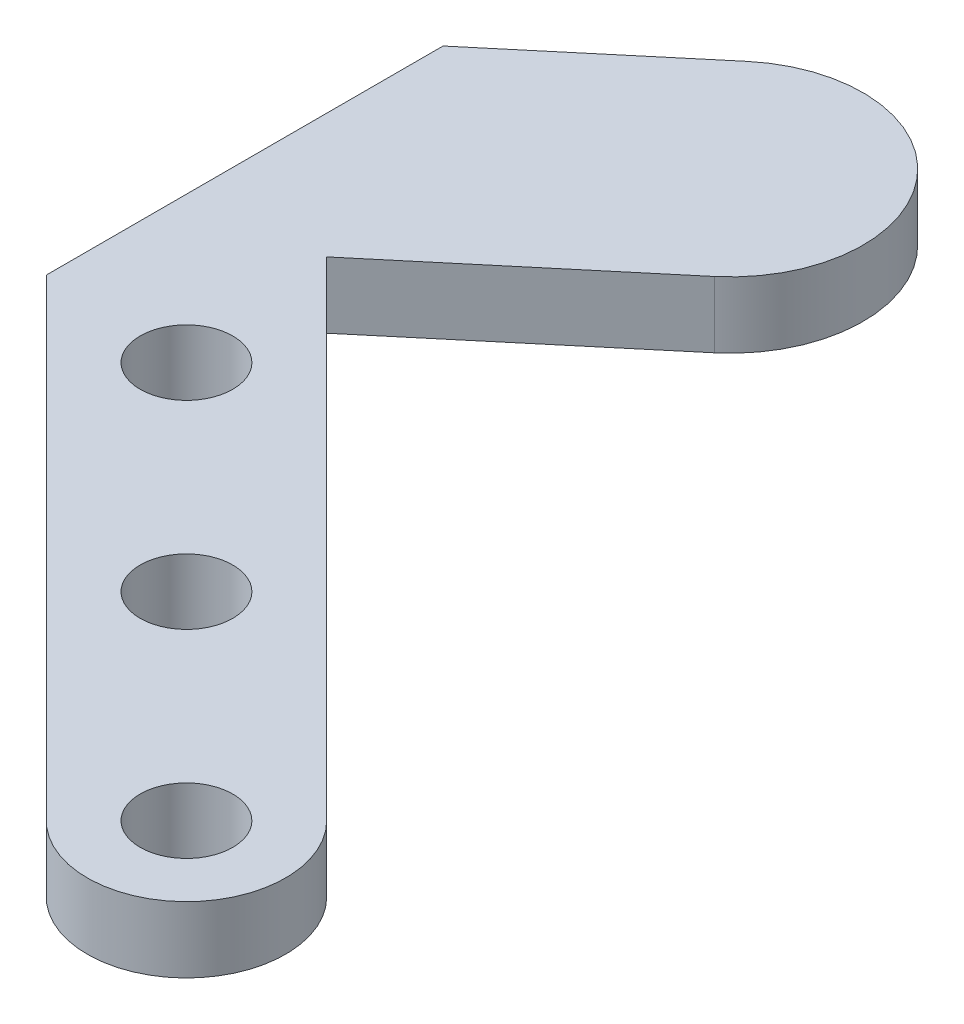
ISO-10303-21;
HEADER;
FILE_DESCRIPTION(('STEP AP214'),'2;1');
FILE_NAME('part.step','',(''),(''),'','','');
FILE_SCHEMA(('AUTOMOTIVE_DESIGN { 1 0 10303 214 1 1 1 1 }'));
ENDSEC;
DATA;
#1=APPLICATION_CONTEXT('core data for automotive mechanical design processes');
#2=APPLICATION_PROTOCOL_DEFINITION('international standard','automotive_design',2000,#1);
#3=PRODUCT_CONTEXT('',#1,'mechanical');
#4=PRODUCT('Part','Part','',(#3));
#5=PRODUCT_RELATED_PRODUCT_CATEGORY('part','',(#4));
#6=PRODUCT_DEFINITION_FORMATION('','',#4);
#7=PRODUCT_DEFINITION_CONTEXT('part definition',#1,'design');
#8=PRODUCT_DEFINITION('design','',#6,#7);
#9=PRODUCT_DEFINITION_SHAPE('','',#8);
#10=(LENGTH_UNIT() NAMED_UNIT(*) SI_UNIT(.MILLI.,.METRE.));
#11=(NAMED_UNIT(*) PLANE_ANGLE_UNIT() SI_UNIT($,.RADIAN.));
#12=(NAMED_UNIT(*) SI_UNIT($,.STERADIAN.) SOLID_ANGLE_UNIT());
#13=UNCERTAINTY_MEASURE_WITH_UNIT(LENGTH_MEASURE(1.E-05),#10,'distance_accuracy_value','');
#14=(GEOMETRIC_REPRESENTATION_CONTEXT(3) GLOBAL_UNCERTAINTY_ASSIGNED_CONTEXT((#13)) GLOBAL_UNIT_ASSIGNED_CONTEXT((#10,
#11,#12)) REPRESENTATION_CONTEXT('',''));
#15=CARTESIAN_POINT('',(0.,0.,0.));
#16=DIRECTION('',(0.,0.,1.));
#17=DIRECTION('',(1.,0.,0.));
#18=AXIS2_PLACEMENT_3D('',#15,#16,#17);
#19=CARTESIAN_POINT('',(20.9118200087334,10.,84.4560368894694));
#20=DIRECTION('',(0.,-1.,0.));
#21=DIRECTION('',(0.,0.,-1.));
#22=AXIS2_PLACEMENT_3D('',#19,#20,#21);
#23=PLANE('',#22);
#24=DIRECTION('',(-0.707106781186546,0.,-0.707106781186549));
#25=VECTOR('',#24,1.);
#26=CARTESIAN_POINT('',(-42.3310134451394,10.,0.));
#27=LINE('',#26,#25);
#28=CARTESIAN_POINT('',(31.5184217265316,10.,73.8494351716712));
#29=VERTEX_POINT('',#28);
#30=CARTESIAN_POINT('',(-42.3310134451394,10.,0.));
#31=VERTEX_POINT('',#30);
#32=EDGE_CURVE('E150',#29,#31,#27,.T.);
#33=ORIENTED_EDGE('',*,*,#32,.T.);
#34=DIRECTION('',(0.766044443118977,0.,-0.64278760968654));
#35=VECTOR('',#34,1.);
#36=CARTESIAN_POINT('',(-42.3310134451394,10.,0.));
#37=LINE('',#36,#35);
#38=CARTESIAN_POINT('',(-10.4448493337618,10.,-26.7556685455152));
#39=VERTEX_POINT('',#38);
#40=EDGE_CURVE('E99',#31,#39,#37,.T.);
#41=ORIENTED_EDGE('',*,*,#40,.T.);
#42=CARTESIAN_POINT('',(-23.3006015274926,10.,-42.0765574078947));
#43=DIRECTION('',(0.,1.,0.));
#44=DIRECTION('',(0.,0.,1.));
#45=AXIS2_PLACEMENT_3D('',#42,#43,#44);
#46=CIRCLE('',#45,20.);
#47=CARTESIAN_POINT('',(-36.1563537212234,10.,-57.3974462702743));
#48=VERTEX_POINT('',#47);
#49=EDGE_CURVE('E159',#39,#48,#46,.T.);
#50=ORIENTED_EDGE('',*,*,#49,.T.);
#51=DIRECTION('',(-0.766044443118977,0.,0.64278760968654));
#52=VECTOR('',#51,1.);
#53=CARTESIAN_POINT('',(-36.1563537212234,10.,-57.3974462702743));
#54=LINE('',#53,#52);
#55=CARTESIAN_POINT('',(-61.1563537212235,10.,-36.4199554908422));
#56=VERTEX_POINT('',#55);
#57=EDGE_CURVE('E116',#48,#56,#54,.T.);
#58=ORIENTED_EDGE('',*,*,#57,.T.);
#59=DIRECTION('',(0.,0.,1.));
#60=VECTOR('',#59,1.);
#61=CARTESIAN_POINT('',(-61.1563537212235,10.,-36.4199554908422));
#62=LINE('',#61,#60);
#63=CARTESIAN_POINT('',(-61.1563537212234,10.,23.5800445091578));
#64=VERTEX_POINT('',#63);
#65=EDGE_CURVE('E110',#56,#64,#62,.T.);
#66=ORIENTED_EDGE('',*,*,#65,.T.);
#67=DIRECTION('',(0.707106781186552,0.,0.707106781186544));
#68=VECTOR('',#67,1.);
#69=CARTESIAN_POINT('',(9.84364627877656,10.,94.580044509157));
#70=LINE('',#69,#68);
#71=CARTESIAN_POINT('',(9.84364627877656,10.,94.580044509157));
#72=VERTEX_POINT('',#71);
#73=EDGE_CURVE('E114',#64,#72,#70,.T.);
#74=ORIENTED_EDGE('',*,*,#73,.T.);
#75=CARTESIAN_POINT('',(20.9118200087334,10.,84.4560368894694));
#76=DIRECTION('',(0.,1.,0.));
#77=DIRECTION('',(0.,0.,-1.));
#78=AXIS2_PLACEMENT_3D('',#75,#76,#77);
#79=CIRCLE('',#78,15.);
#80=EDGE_CURVE('E58',#72,#29,#79,.T.);
#81=ORIENTED_EDGE('',*,*,#80,.T.);
#82=EDGE_LOOP('',(#33,#41,#50,#58,#66,#74,#81));
#83=FACE_BOUND('',#82,.T.);
#84=CARTESIAN_POINT('',(20.9118200087334,10.,84.4560368894694));
#85=DIRECTION('',(0.,1.,0.));
#86=DIRECTION('',(0.,0.,1.));
#87=AXIS2_PLACEMENT_3D('',#84,#85,#86);
#88=CIRCLE('',#87,7.);
#89=CARTESIAN_POINT('',(20.9118200087334,10.,91.4560368894694));
#90=VERTEX_POINT('',#89);
#91=EDGE_CURVE('E138',#90,#90,#88,.T.);
#92=ORIENTED_EDGE('',*,*,#91,.F.);
#93=EDGE_LOOP('',(#92));
#94=FACE_BOUND('',#93,.T.);
#95=CARTESIAN_POINT('',(-9.08817999126664,10.,54.4560368894697));
#96=DIRECTION('',(0.,1.,0.));
#97=DIRECTION('',(0.,0.,1.));
#98=AXIS2_PLACEMENT_3D('',#95,#96,#97);
#99=CIRCLE('',#98,7.);
#100=CARTESIAN_POINT('',(-9.08817999126664,10.,61.4560368894697));
#101=VERTEX_POINT('',#100);
#102=EDGE_CURVE('E174',#101,#101,#99,.T.);
#103=ORIENTED_EDGE('',*,*,#102,.F.);
#104=EDGE_LOOP('',(#103));
#105=FACE_BOUND('',#104,.T.);
#106=CARTESIAN_POINT('',(-39.0881799912666,10.,24.45603688947));
#107=DIRECTION('',(0.,1.,0.));
#108=DIRECTION('',(0.,0.,1.));
#109=AXIS2_PLACEMENT_3D('',#106,#107,#108);
#110=CIRCLE('',#109,7.);
#111=CARTESIAN_POINT('',(-39.0881799912666,10.,31.45603688947));
#112=VERTEX_POINT('',#111);
#113=EDGE_CURVE('E179',#112,#112,#110,.T.);
#114=ORIENTED_EDGE('',*,*,#113,.F.);
#115=EDGE_LOOP('',(#114));
#116=FACE_BOUND('',#115,.T.);
#117=ADVANCED_FACE('F43',(#83,#94,#105,#116),#23,.F.);
#118=CARTESIAN_POINT('',(20.9118200087334,0.,84.4560368894694));
#119=DIRECTION('',(0.,-1.,0.));
#120=DIRECTION('',(0.,0.,-1.));
#121=AXIS2_PLACEMENT_3D('',#118,#119,#120);
#122=PLANE('',#121);
#123=CARTESIAN_POINT('',(-9.08817999126664,0.,54.4560368894697));
#124=DIRECTION('',(0.,1.,0.));
#125=DIRECTION('',(0.,0.,1.));
#126=AXIS2_PLACEMENT_3D('',#123,#124,#125);
#127=CIRCLE('',#126,7.);
#128=CARTESIAN_POINT('',(-9.08817999126664,0.,61.4560368894697));
#129=VERTEX_POINT('',#128);
#130=EDGE_CURVE('E180',#129,#129,#127,.T.);
#131=ORIENTED_EDGE('',*,*,#130,.T.);
#132=EDGE_LOOP('',(#131));
#133=FACE_BOUND('',#132,.T.);
#134=DIRECTION('',(-0.707106781186546,0.,-0.707106781186549));
#135=VECTOR('',#134,1.);
#136=CARTESIAN_POINT('',(-42.3310134451394,0.,0.));
#137=LINE('',#136,#135);
#138=CARTESIAN_POINT('',(31.5184217265316,0.,73.8494351716712));
#139=VERTEX_POINT('',#138);
#140=CARTESIAN_POINT('',(-42.3310134451394,0.,0.));
#141=VERTEX_POINT('',#140);
#142=EDGE_CURVE('E132',#139,#141,#137,.T.);
#143=ORIENTED_EDGE('',*,*,#142,.F.);
#144=CARTESIAN_POINT('',(20.9118200087334,0.,84.4560368894694));
#145=DIRECTION('',(0.,1.,0.));
#146=DIRECTION('',(0.,0.,-1.));
#147=AXIS2_PLACEMENT_3D('',#144,#145,#146);
#148=CIRCLE('',#147,15.);
#149=CARTESIAN_POINT('',(9.84364627877656,0.,94.580044509157));
#150=VERTEX_POINT('',#149);
#151=EDGE_CURVE('E95',#150,#139,#148,.T.);
#152=ORIENTED_EDGE('',*,*,#151,.F.);
#153=DIRECTION('',(0.707106781186552,0.,0.707106781186544));
#154=VECTOR('',#153,1.);
#155=CARTESIAN_POINT('',(9.84364627877656,0.,94.580044509157));
#156=LINE('',#155,#154);
#157=CARTESIAN_POINT('',(-61.1563537212234,0.,23.5800445091578));
#158=VERTEX_POINT('',#157);
#159=EDGE_CURVE('E86',#158,#150,#156,.T.);
#160=ORIENTED_EDGE('',*,*,#159,.F.);
#161=DIRECTION('',(0.,0.,1.));
#162=VECTOR('',#161,1.);
#163=CARTESIAN_POINT('',(-61.1563537212235,0.,-36.4199554908422));
#164=LINE('',#163,#162);
#165=CARTESIAN_POINT('',(-61.1563537212235,0.,-36.4199554908422));
#166=VERTEX_POINT('',#165);
#167=EDGE_CURVE('E125',#166,#158,#164,.T.);
#168=ORIENTED_EDGE('',*,*,#167,.F.);
#169=DIRECTION('',(-0.766044443118977,0.,0.64278760968654));
#170=VECTOR('',#169,1.);
#171=CARTESIAN_POINT('',(-36.1563537212234,0.,-57.3974462702743));
#172=LINE('',#171,#170);
#173=CARTESIAN_POINT('',(-36.1563537212234,0.,-57.3974462702743));
#174=VERTEX_POINT('',#173);
#175=EDGE_CURVE('E145',#174,#166,#172,.T.);
#176=ORIENTED_EDGE('',*,*,#175,.F.);
#177=CARTESIAN_POINT('',(-23.3006015274926,0.,-42.0765574078947));
#178=DIRECTION('',(0.,1.,0.));
#179=DIRECTION('',(0.,0.,1.));
#180=AXIS2_PLACEMENT_3D('',#177,#178,#179);
#181=CIRCLE('',#180,20.);
#182=CARTESIAN_POINT('',(-10.4448493337618,0.,-26.7556685455152));
#183=VERTEX_POINT('',#182);
#184=EDGE_CURVE('E139',#183,#174,#181,.T.);
#185=ORIENTED_EDGE('',*,*,#184,.F.);
#186=DIRECTION('',(0.766044443118977,0.,-0.64278760968654));
#187=VECTOR('',#186,1.);
#188=CARTESIAN_POINT('',(-42.3310134451394,0.,0.));
#189=LINE('',#188,#187);
#190=EDGE_CURVE('E140',#141,#183,#189,.T.);
#191=ORIENTED_EDGE('',*,*,#190,.F.);
#192=EDGE_LOOP('',(#143,#152,#160,#168,#176,#185,#191));
#193=FACE_BOUND('',#192,.T.);
#194=CARTESIAN_POINT('',(20.9118200087334,0.,84.4560368894694));
#195=DIRECTION('',(0.,1.,0.));
#196=DIRECTION('',(0.,0.,1.));
#197=AXIS2_PLACEMENT_3D('',#194,#195,#196);
#198=CIRCLE('',#197,7.);
#199=CARTESIAN_POINT('',(20.9118200087334,0.,91.4560368894694));
#200=VERTEX_POINT('',#199);
#201=EDGE_CURVE('E173',#200,#200,#198,.T.);
#202=ORIENTED_EDGE('',*,*,#201,.T.);
#203=EDGE_LOOP('',(#202));
#204=FACE_BOUND('',#203,.T.);
#205=CARTESIAN_POINT('',(-39.0881799912666,0.,24.45603688947));
#206=DIRECTION('',(0.,1.,0.));
#207=DIRECTION('',(0.,0.,1.));
#208=AXIS2_PLACEMENT_3D('',#205,#206,#207);
#209=CIRCLE('',#208,7.);
#210=CARTESIAN_POINT('',(-39.0881799912666,0.,31.45603688947));
#211=VERTEX_POINT('',#210);
#212=EDGE_CURVE('E183',#211,#211,#209,.T.);
#213=ORIENTED_EDGE('',*,*,#212,.T.);
#214=EDGE_LOOP('',(#213));
#215=FACE_BOUND('',#214,.T.);
#216=ADVANCED_FACE('F164',(#133,#193,#204,#215),#122,.T.);
#217=CARTESIAN_POINT('',(-42.3310134451394,10.,0.));
#218=DIRECTION('',(-0.707106781186549,0.,0.707106781186546));
#219=DIRECTION('',(0.707106781186546,0.,0.707106781186549));
#220=AXIS2_PLACEMENT_3D('',#217,#218,#219);
#221=PLANE('',#220);
#222=ORIENTED_EDGE('',*,*,#142,.T.);
#223=DIRECTION('',(0.,-1.,0.));
#224=VECTOR('',#223,1.);
#225=CARTESIAN_POINT('',(-42.3310134451394,10.,0.));
#226=LINE('',#225,#224);
#227=EDGE_CURVE('E11',#31,#141,#226,.T.);
#228=ORIENTED_EDGE('',*,*,#227,.F.);
#229=ORIENTED_EDGE('',*,*,#32,.F.);
#230=DIRECTION('',(0.,-1.,0.));
#231=VECTOR('',#230,1.);
#232=CARTESIAN_POINT('',(31.5184217265316,10.,73.8494351716712));
#233=LINE('',#232,#231);
#234=EDGE_CURVE('E127',#29,#139,#233,.T.);
#235=ORIENTED_EDGE('',*,*,#234,.T.);
#236=EDGE_LOOP('',(#222,#228,#229,#235));
#237=FACE_BOUND('',#236,.T.);
#238=ADVANCED_FACE('F44',(#237),#221,.F.);
#239=CARTESIAN_POINT('',(-42.3310134451394,10.,0.));
#240=DIRECTION('',(-0.64278760968654,0.,-0.766044443118977));
#241=DIRECTION('',(-0.766044443118977,0.,0.64278760968654));
#242=AXIS2_PLACEMENT_3D('',#239,#240,#241);
#243=PLANE('',#242);
#244=ORIENTED_EDGE('',*,*,#190,.T.);
#245=DIRECTION('',(0.,-1.,0.));
#246=VECTOR('',#245,1.);
#247=CARTESIAN_POINT('',(-10.4448493337618,10.,-26.7556685455152));
#248=LINE('',#247,#246);
#249=EDGE_CURVE('E55',#39,#183,#248,.T.);
#250=ORIENTED_EDGE('',*,*,#249,.F.);
#251=ORIENTED_EDGE('',*,*,#40,.F.);
#252=ORIENTED_EDGE('',*,*,#227,.T.);
#253=EDGE_LOOP('',(#244,#250,#251,#252));
#254=FACE_BOUND('',#253,.T.);
#255=ADVANCED_FACE('F211',(#254),#243,.F.);
#256=CARTESIAN_POINT('',(-23.3006015274926,10.,-42.0765574078947));
#257=DIRECTION('',(0.,-1.,0.));
#258=DIRECTION('',(0.,0.,-1.));
#259=AXIS2_PLACEMENT_3D('',#256,#257,#258);
#260=CYLINDRICAL_SURFACE('',#259,20.);
#261=ORIENTED_EDGE('',*,*,#184,.T.);
#262=DIRECTION('',(0.,-1.,0.));
#263=VECTOR('',#262,1.);
#264=CARTESIAN_POINT('',(-36.1563537212234,10.,-57.3974462702743));
#265=LINE('',#264,#263);
#266=EDGE_CURVE('E151',#48,#174,#265,.T.);
#267=ORIENTED_EDGE('',*,*,#266,.F.);
#268=ORIENTED_EDGE('',*,*,#49,.F.);
#269=ORIENTED_EDGE('',*,*,#249,.T.);
#270=EDGE_LOOP('',(#261,#267,#268,#269));
#271=FACE_BOUND('',#270,.T.);
#272=ADVANCED_FACE('F160',(#271),#260,.T.);
#273=CARTESIAN_POINT('',(-36.1563537212234,10.,-57.3974462702743));
#274=DIRECTION('',(0.64278760968654,0.,0.766044443118977));
#275=DIRECTION('',(0.766044443118977,0.,-0.64278760968654));
#276=AXIS2_PLACEMENT_3D('',#273,#274,#275);
#277=PLANE('',#276);
#278=ORIENTED_EDGE('',*,*,#175,.T.);
#279=DIRECTION('',(0.,-1.,0.));
#280=VECTOR('',#279,1.);
#281=CARTESIAN_POINT('',(-61.1563537212235,10.,-36.4199554908422));
#282=LINE('',#281,#280);
#283=EDGE_CURVE('E124',#56,#166,#282,.T.);
#284=ORIENTED_EDGE('',*,*,#283,.F.);
#285=ORIENTED_EDGE('',*,*,#57,.F.);
#286=ORIENTED_EDGE('',*,*,#266,.T.);
#287=EDGE_LOOP('',(#278,#284,#285,#286));
#288=FACE_BOUND('',#287,.T.);
#289=ADVANCED_FACE('F168',(#288),#277,.F.);
#290=CARTESIAN_POINT('',(-61.1563537212235,10.,-36.4199554908422));
#291=DIRECTION('',(1.,0.,0.));
#292=DIRECTION('',(0.,0.,-1.));
#293=AXIS2_PLACEMENT_3D('',#290,#291,#292);
#294=PLANE('',#293);
#295=ORIENTED_EDGE('',*,*,#167,.T.);
#296=DIRECTION('',(0.,-1.,0.));
#297=VECTOR('',#296,1.);
#298=CARTESIAN_POINT('',(-61.1563537212234,10.,23.5800445091578));
#299=LINE('',#298,#297);
#300=EDGE_CURVE('E123',#64,#158,#299,.T.);
#301=ORIENTED_EDGE('',*,*,#300,.F.);
#302=ORIENTED_EDGE('',*,*,#65,.F.);
#303=ORIENTED_EDGE('',*,*,#283,.T.);
#304=EDGE_LOOP('',(#295,#301,#302,#303));
#305=FACE_BOUND('',#304,.T.);
#306=ADVANCED_FACE('F122',(#305),#294,.F.);
#307=CARTESIAN_POINT('',(9.84364627877656,10.,94.580044509157));
#308=DIRECTION('',(0.707106781186544,0.,-0.707106781186552));
#309=DIRECTION('',(-0.707106781186551,0.,-0.707106781186544));
#310=AXIS2_PLACEMENT_3D('',#307,#308,#309);
#311=PLANE('',#310);
#312=ORIENTED_EDGE('',*,*,#159,.T.);
#313=DIRECTION('',(0.,-1.,0.));
#314=VECTOR('',#313,1.);
#315=CARTESIAN_POINT('',(9.84364627877656,10.,94.580044509157));
#316=LINE('',#315,#314);
#317=EDGE_CURVE('E128',#72,#150,#316,.T.);
#318=ORIENTED_EDGE('',*,*,#317,.F.);
#319=ORIENTED_EDGE('',*,*,#73,.F.);
#320=ORIENTED_EDGE('',*,*,#300,.T.);
#321=EDGE_LOOP('',(#312,#318,#319,#320));
#322=FACE_BOUND('',#321,.T.);
#323=ADVANCED_FACE('F126',(#322),#311,.F.);
#324=CARTESIAN_POINT('',(20.9118200087334,10.,84.4560368894694));
#325=DIRECTION('',(0.,-1.,0.));
#326=DIRECTION('',(0.,0.,-1.));
#327=AXIS2_PLACEMENT_3D('',#324,#325,#326);
#328=CYLINDRICAL_SURFACE('',#327,15.);
#329=ORIENTED_EDGE('',*,*,#151,.T.);
#330=ORIENTED_EDGE('',*,*,#234,.F.);
#331=ORIENTED_EDGE('',*,*,#80,.F.);
#332=ORIENTED_EDGE('',*,*,#317,.T.);
#333=EDGE_LOOP('',(#329,#330,#331,#332));
#334=FACE_BOUND('',#333,.T.);
#335=ADVANCED_FACE('F201',(#334),#328,.T.);
#336=CARTESIAN_POINT('',(20.9118200087334,10.,84.4560368894694));
#337=DIRECTION('',(0.,-1.,0.));
#338=DIRECTION('',(0.,0.,-1.));
#339=AXIS2_PLACEMENT_3D('',#336,#337,#338);
#340=CYLINDRICAL_SURFACE('',#339,7.);
#341=ORIENTED_EDGE('',*,*,#91,.T.);
#342=EDGE_LOOP('',(#341));
#343=FACE_BOUND('',#342,.T.);
#344=ORIENTED_EDGE('',*,*,#201,.F.);
#345=EDGE_LOOP('',(#344));
#346=FACE_BOUND('',#345,.T.);
#347=ADVANCED_FACE('F200',(#343,#346),#340,.F.);
#348=CARTESIAN_POINT('',(-9.08817999126664,10.,54.4560368894697));
#349=DIRECTION('',(0.,-1.,0.));
#350=DIRECTION('',(0.,0.,-1.));
#351=AXIS2_PLACEMENT_3D('',#348,#349,#350);
#352=CYLINDRICAL_SURFACE('',#351,7.);
#353=ORIENTED_EDGE('',*,*,#102,.T.);
#354=EDGE_LOOP('',(#353));
#355=FACE_BOUND('',#354,.T.);
#356=ORIENTED_EDGE('',*,*,#130,.F.);
#357=EDGE_LOOP('',(#356));
#358=FACE_BOUND('',#357,.T.);
#359=ADVANCED_FACE('F301',(#355,#358),#352,.F.);
#360=CARTESIAN_POINT('',(-39.0881799912666,10.,24.45603688947));
#361=DIRECTION('',(0.,-1.,0.));
#362=DIRECTION('',(0.,0.,-1.));
#363=AXIS2_PLACEMENT_3D('',#360,#361,#362);
#364=CYLINDRICAL_SURFACE('',#363,7.);
#365=ORIENTED_EDGE('',*,*,#113,.T.);
#366=EDGE_LOOP('',(#365));
#367=FACE_BOUND('',#366,.T.);
#368=ORIENTED_EDGE('',*,*,#212,.F.);
#369=EDGE_LOOP('',(#368));
#370=FACE_BOUND('',#369,.T.);
#371=ADVANCED_FACE('F188',(#367,#370),#364,.F.);
#372=CLOSED_SHELL('',(#117,#216,#238,#255,#272,#289,#306,#323,#335,#347,#359,#371));
#373=MANIFOLD_SOLID_BREP('B2',#372);
#374=ADVANCED_BREP_SHAPE_REPRESENTATION('',(#18,#373),#14);
#375=SHAPE_DEFINITION_REPRESENTATION(#9,#374);
ENDSEC;
END-ISO-10303-21;
